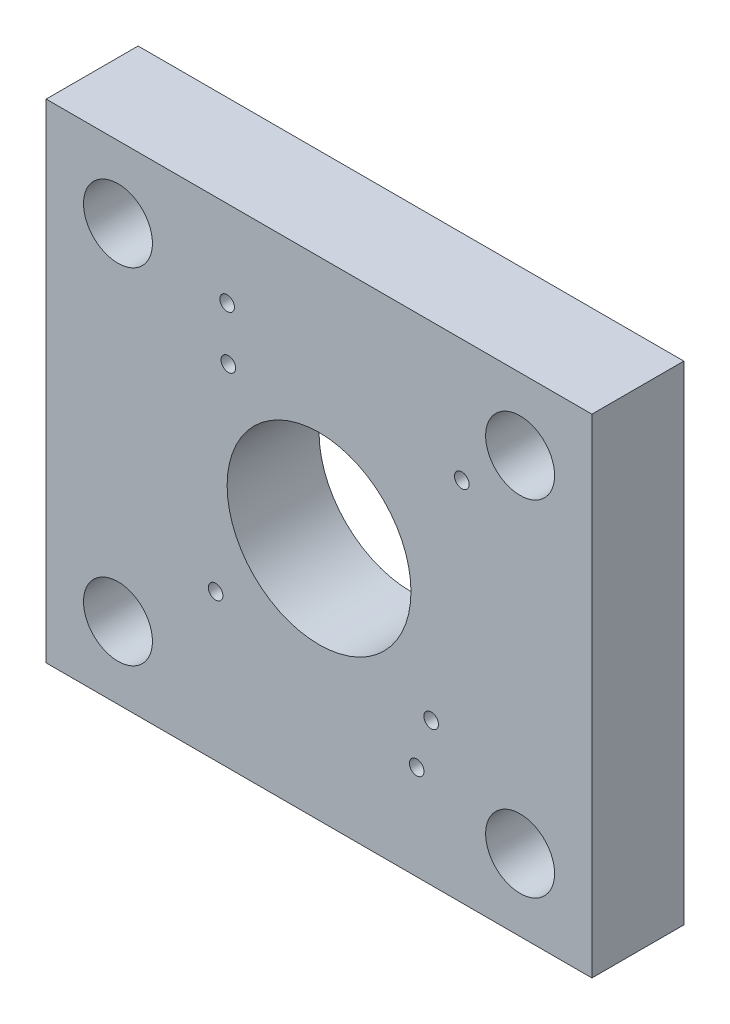
ISO-10303-21;
HEADER;
FILE_DESCRIPTION(('STEP AP214'),'2;1');
FILE_NAME('part.step','',(''),(''),'','','');
FILE_SCHEMA(('AUTOMOTIVE_DESIGN { 1 0 10303 214 1 1 1 1 }'));
ENDSEC;
DATA;
#1=APPLICATION_CONTEXT('core data for automotive mechanical design processes');
#2=APPLICATION_PROTOCOL_DEFINITION('international standard','automotive_design',2000,#1);
#3=PRODUCT_CONTEXT('',#1,'mechanical');
#4=PRODUCT('Part','Part','',(#3));
#5=PRODUCT_RELATED_PRODUCT_CATEGORY('part','',(#4));
#6=PRODUCT_DEFINITION_FORMATION('','',#4);
#7=PRODUCT_DEFINITION_CONTEXT('part definition',#1,'design');
#8=PRODUCT_DEFINITION('design','',#6,#7);
#9=PRODUCT_DEFINITION_SHAPE('','',#8);
#10=(LENGTH_UNIT() NAMED_UNIT(*) SI_UNIT(.MILLI.,.METRE.));
#11=(NAMED_UNIT(*) PLANE_ANGLE_UNIT() SI_UNIT($,.RADIAN.));
#12=(NAMED_UNIT(*) SI_UNIT($,.STERADIAN.) SOLID_ANGLE_UNIT());
#13=UNCERTAINTY_MEASURE_WITH_UNIT(LENGTH_MEASURE(1.E-05),#10,'distance_accuracy_value','');
#14=(GEOMETRIC_REPRESENTATION_CONTEXT(3) GLOBAL_UNCERTAINTY_ASSIGNED_CONTEXT((#13)) GLOBAL_UNIT_ASSIGNED_CONTEXT((#10,
#11,#12)) REPRESENTATION_CONTEXT('',''));
#15=CARTESIAN_POINT('',(0.,0.,0.));
#16=DIRECTION('',(0.,0.,1.));
#17=DIRECTION('',(1.,0.,0.));
#18=AXIS2_PLACEMENT_3D('',#15,#16,#17);
#19=CARTESIAN_POINT('',(-0.25,-0.25,1.6));
#20=DIRECTION('',(1.,0.,0.));
#21=DIRECTION('',(0.,0.,-1.));
#22=AXIS2_PLACEMENT_3D('',#19,#20,#21);
#23=PLANE('',#22);
#24=DIRECTION('',(0.,-1.,0.));
#25=VECTOR('',#24,1.);
#26=CARTESIAN_POINT('',(-0.25,-0.25,0.));
#27=LINE('',#26,#25);
#28=CARTESIAN_POINT('',(-0.25,8.25,0.));
#29=VERTEX_POINT('',#28);
#30=CARTESIAN_POINT('',(-0.25,-0.25,0.));
#31=VERTEX_POINT('',#30);
#32=EDGE_CURVE('E107',#29,#31,#27,.T.);
#33=ORIENTED_EDGE('',*,*,#32,.T.);
#34=DIRECTION('',(0.,0.,-1.));
#35=VECTOR('',#34,1.);
#36=CARTESIAN_POINT('',(-0.25,-0.25,1.6));
#37=LINE('',#36,#35);
#38=CARTESIAN_POINT('',(-0.25,-0.25,1.6));
#39=VERTEX_POINT('',#38);
#40=EDGE_CURVE('E13',#39,#31,#37,.T.);
#41=ORIENTED_EDGE('',*,*,#40,.F.);
#42=DIRECTION('',(0.,-1.,0.));
#43=VECTOR('',#42,1.);
#44=CARTESIAN_POINT('',(-0.25,-0.25,1.6));
#45=LINE('',#44,#43);
#46=CARTESIAN_POINT('',(-0.25,8.25,1.6));
#47=VERTEX_POINT('',#46);
#48=EDGE_CURVE('E95',#47,#39,#45,.T.);
#49=ORIENTED_EDGE('',*,*,#48,.F.);
#50=DIRECTION('',(0.,0.,-1.));
#51=VECTOR('',#50,1.);
#52=CARTESIAN_POINT('',(-0.25,8.25,1.6));
#53=LINE('',#52,#51);
#54=EDGE_CURVE('E103',#47,#29,#53,.T.);
#55=ORIENTED_EDGE('',*,*,#54,.T.);
#56=EDGE_LOOP('',(#33,#41,#49,#55));
#57=FACE_BOUND('',#56,.T.);
#58=ADVANCED_FACE('F44',(#57),#23,.F.);
#59=CARTESIAN_POINT('',(9.25,-0.25,1.6));
#60=DIRECTION('',(0.,1.,0.));
#61=DIRECTION('',(0.,0.,1.));
#62=AXIS2_PLACEMENT_3D('',#59,#60,#61);
#63=PLANE('',#62);
#64=DIRECTION('',(1.,0.,0.));
#65=VECTOR('',#64,1.);
#66=CARTESIAN_POINT('',(9.25,-0.25,0.));
#67=LINE('',#66,#65);
#68=CARTESIAN_POINT('',(9.25,-0.25,0.));
#69=VERTEX_POINT('',#68);
#70=EDGE_CURVE('E99',#31,#69,#67,.T.);
#71=ORIENTED_EDGE('',*,*,#70,.T.);
#72=DIRECTION('',(0.,0.,-1.));
#73=VECTOR('',#72,1.);
#74=CARTESIAN_POINT('',(9.25,-0.25,1.6));
#75=LINE('',#74,#73);
#76=CARTESIAN_POINT('',(9.25,-0.25,1.6));
#77=VERTEX_POINT('',#76);
#78=EDGE_CURVE('E52',#77,#69,#75,.T.);
#79=ORIENTED_EDGE('',*,*,#78,.F.);
#80=DIRECTION('',(1.,0.,0.));
#81=VECTOR('',#80,1.);
#82=CARTESIAN_POINT('',(9.25,-0.25,1.6));
#83=LINE('',#82,#81);
#84=EDGE_CURVE('E90',#39,#77,#83,.T.);
#85=ORIENTED_EDGE('',*,*,#84,.F.);
#86=ORIENTED_EDGE('',*,*,#40,.T.);
#87=EDGE_LOOP('',(#71,#79,#85,#86));
#88=FACE_BOUND('',#87,.T.);
#89=ADVANCED_FACE('F98',(#88),#63,.F.);
#90=CARTESIAN_POINT('',(9.25,8.25,1.6));
#91=DIRECTION('',(-1.,0.,0.));
#92=DIRECTION('',(0.,0.,1.));
#93=AXIS2_PLACEMENT_3D('',#90,#91,#92);
#94=PLANE('',#93);
#95=DIRECTION('',(0.,1.,0.));
#96=VECTOR('',#95,1.);
#97=CARTESIAN_POINT('',(9.25,8.25,0.));
#98=LINE('',#97,#96);
#99=CARTESIAN_POINT('',(9.25,8.25,0.));
#100=VERTEX_POINT('',#99);
#101=EDGE_CURVE('E77',#69,#100,#98,.T.);
#102=ORIENTED_EDGE('',*,*,#101,.T.);
#103=DIRECTION('',(0.,0.,-1.));
#104=VECTOR('',#103,1.);
#105=CARTESIAN_POINT('',(9.25,8.25,1.6));
#106=LINE('',#105,#104);
#107=CARTESIAN_POINT('',(9.25,8.25,1.6));
#108=VERTEX_POINT('',#107);
#109=EDGE_CURVE('E100',#108,#100,#106,.T.);
#110=ORIENTED_EDGE('',*,*,#109,.F.);
#111=DIRECTION('',(0.,1.,0.));
#112=VECTOR('',#111,1.);
#113=CARTESIAN_POINT('',(9.25,8.25,1.6));
#114=LINE('',#113,#112);
#115=EDGE_CURVE('E93',#77,#108,#114,.T.);
#116=ORIENTED_EDGE('',*,*,#115,.F.);
#117=ORIENTED_EDGE('',*,*,#78,.T.);
#118=EDGE_LOOP('',(#102,#110,#116,#117));
#119=FACE_BOUND('',#118,.T.);
#120=ADVANCED_FACE('F101',(#119),#94,.F.);
#121=CARTESIAN_POINT('',(-0.25,8.25,1.6));
#122=DIRECTION('',(0.,-1.,0.));
#123=DIRECTION('',(0.,0.,-1.));
#124=AXIS2_PLACEMENT_3D('',#121,#122,#123);
#125=PLANE('',#124);
#126=DIRECTION('',(-1.,0.,0.));
#127=VECTOR('',#126,1.);
#128=CARTESIAN_POINT('',(-0.25,8.25,0.));
#129=LINE('',#128,#127);
#130=EDGE_CURVE('E83',#100,#29,#129,.T.);
#131=ORIENTED_EDGE('',*,*,#130,.T.);
#132=ORIENTED_EDGE('',*,*,#54,.F.);
#133=DIRECTION('',(-1.,0.,0.));
#134=VECTOR('',#133,1.);
#135=CARTESIAN_POINT('',(-0.25,8.25,1.6));
#136=LINE('',#135,#134);
#137=EDGE_CURVE('E60',#108,#47,#136,.T.);
#138=ORIENTED_EDGE('',*,*,#137,.F.);
#139=ORIENTED_EDGE('',*,*,#109,.T.);
#140=EDGE_LOOP('',(#131,#132,#138,#139));
#141=FACE_BOUND('',#140,.T.);
#142=ADVANCED_FACE('F115',(#141),#125,.F.);
#143=CARTESIAN_POINT('',(0.,0.,1.6));
#144=DIRECTION('',(0.,0.,-1.));
#145=DIRECTION('',(-1.,0.,0.));
#146=AXIS2_PLACEMENT_3D('',#143,#144,#145);
#147=PLANE('',#146);
#148=CARTESIAN_POINT('',(2.921,5.842,1.6));
#149=DIRECTION('',(0.,0.,1.));
#150=DIRECTION('',(1.,0.,0.));
#151=AXIS2_PLACEMENT_3D('',#148,#149,#150);
#152=CIRCLE('',#151,0.127);
#153=CARTESIAN_POINT('',(3.048,5.842,1.6));
#154=VERTEX_POINT('',#153);
#155=EDGE_CURVE('E154',#154,#154,#152,.T.);
#156=ORIENTED_EDGE('',*,*,#155,.F.);
#157=EDGE_LOOP('',(#156));
#158=FACE_BOUND('',#157,.T.);
#159=CARTESIAN_POINT('',(2.9,6.7492,1.6));
#160=DIRECTION('',(0.,0.,1.));
#161=DIRECTION('',(1.,0.,0.));
#162=AXIS2_PLACEMENT_3D('',#159,#160,#161);
#163=CIRCLE('',#162,0.127);
#164=CARTESIAN_POINT('',(3.027,6.7492,1.6));
#165=VERTEX_POINT('',#164);
#166=EDGE_CURVE('E161',#165,#165,#163,.T.);
#167=ORIENTED_EDGE('',*,*,#166,.F.);
#168=EDGE_LOOP('',(#167));
#169=FACE_BOUND('',#168,.T.);
#170=CARTESIAN_POINT('',(6.2,1.4,1.6));
#171=DIRECTION('',(0.,0.,1.));
#172=DIRECTION('',(1.,0.,0.));
#173=AXIS2_PLACEMENT_3D('',#170,#171,#172);
#174=CIRCLE('',#173,0.127);
#175=CARTESIAN_POINT('',(6.327,1.4,1.6));
#176=VERTEX_POINT('',#175);
#177=EDGE_CURVE('E167',#176,#176,#174,.T.);
#178=ORIENTED_EDGE('',*,*,#177,.F.);
#179=EDGE_LOOP('',(#178));
#180=FACE_BOUND('',#179,.T.);
#181=CARTESIAN_POINT('',(2.7,2.3,1.6));
#182=DIRECTION('',(0.,0.,1.));
#183=DIRECTION('',(1.,0.,0.));
#184=AXIS2_PLACEMENT_3D('',#181,#182,#183);
#185=CIRCLE('',#184,0.127);
#186=CARTESIAN_POINT('',(2.827,2.3,1.6));
#187=VERTEX_POINT('',#186);
#188=EDGE_CURVE('E131',#187,#187,#185,.T.);
#189=ORIENTED_EDGE('',*,*,#188,.F.);
#190=EDGE_LOOP('',(#189));
#191=FACE_BOUND('',#190,.T.);
#192=CARTESIAN_POINT('',(4.5,4.,1.6));
#193=DIRECTION('',(0.,0.,1.));
#194=DIRECTION('',(1.,0.,0.));
#195=AXIS2_PLACEMENT_3D('',#192,#193,#194);
#196=CIRCLE('',#195,1.6);
#197=CARTESIAN_POINT('',(6.1,4.,1.6));
#198=VERTEX_POINT('',#197);
#199=EDGE_CURVE('E130',#198,#198,#196,.T.);
#200=ORIENTED_EDGE('',*,*,#199,.F.);
#201=EDGE_LOOP('',(#200));
#202=FACE_BOUND('',#201,.T.);
#203=CARTESIAN_POINT('',(8.,1.,1.6));
#204=DIRECTION('',(0.,0.,1.));
#205=DIRECTION('',(1.,0.,0.));
#206=AXIS2_PLACEMENT_3D('',#203,#204,#205);
#207=CIRCLE('',#206,0.6);
#208=CARTESIAN_POINT('',(8.6,1.,1.6));
#209=VERTEX_POINT('',#208);
#210=EDGE_CURVE('E137',#209,#209,#207,.T.);
#211=ORIENTED_EDGE('',*,*,#210,.F.);
#212=EDGE_LOOP('',(#211));
#213=FACE_BOUND('',#212,.T.);
#214=CARTESIAN_POINT('',(1.,1.,1.6));
#215=DIRECTION('',(0.,0.,1.));
#216=DIRECTION('',(1.,0.,0.));
#217=AXIS2_PLACEMENT_3D('',#214,#215,#216);
#218=CIRCLE('',#217,0.6);
#219=CARTESIAN_POINT('',(1.6,1.,1.6));
#220=VERTEX_POINT('',#219);
#221=EDGE_CURVE('E143',#220,#220,#218,.T.);
#222=ORIENTED_EDGE('',*,*,#221,.F.);
#223=EDGE_LOOP('',(#222));
#224=FACE_BOUND('',#223,.T.);
#225=CARTESIAN_POINT('',(1.,7.,1.6));
#226=DIRECTION('',(0.,0.,1.));
#227=DIRECTION('',(1.,0.,0.));
#228=AXIS2_PLACEMENT_3D('',#225,#226,#227);
#229=CIRCLE('',#228,0.6);
#230=CARTESIAN_POINT('',(1.6,7.,1.6));
#231=VERTEX_POINT('',#230);
#232=EDGE_CURVE('E124',#231,#231,#229,.T.);
#233=ORIENTED_EDGE('',*,*,#232,.F.);
#234=EDGE_LOOP('',(#233));
#235=FACE_BOUND('',#234,.T.);
#236=CARTESIAN_POINT('',(6.4516,2.2352,1.6));
#237=DIRECTION('',(0.,0.,1.));
#238=DIRECTION('',(1.,0.,0.));
#239=AXIS2_PLACEMENT_3D('',#236,#237,#238);
#240=CIRCLE('',#239,0.127);
#241=CARTESIAN_POINT('',(6.5786,2.2352,1.6));
#242=VERTEX_POINT('',#241);
#243=EDGE_CURVE('E155',#242,#242,#240,.T.);
#244=ORIENTED_EDGE('',*,*,#243,.F.);
#245=EDGE_LOOP('',(#244));
#246=FACE_BOUND('',#245,.T.);
#247=CARTESIAN_POINT('',(6.985,6.1214,1.6));
#248=DIRECTION('',(0.,0.,1.));
#249=DIRECTION('',(1.,0.,0.));
#250=AXIS2_PLACEMENT_3D('',#247,#248,#249);
#251=CIRCLE('',#250,0.127);
#252=CARTESIAN_POINT('',(7.112,6.1214,1.6));
#253=VERTEX_POINT('',#252);
#254=EDGE_CURVE('E178',#253,#253,#251,.T.);
#255=ORIENTED_EDGE('',*,*,#254,.F.);
#256=EDGE_LOOP('',(#255));
#257=FACE_BOUND('',#256,.T.);
#258=CARTESIAN_POINT('',(8.,7.,1.6));
#259=DIRECTION('',(0.,0.,1.));
#260=DIRECTION('',(1.,0.,0.));
#261=AXIS2_PLACEMENT_3D('',#258,#259,#260);
#262=CIRCLE('',#261,0.6);
#263=CARTESIAN_POINT('',(8.6,7.,1.6));
#264=VERTEX_POINT('',#263);
#265=EDGE_CURVE('E110',#264,#264,#262,.T.);
#266=ORIENTED_EDGE('',*,*,#265,.F.);
#267=EDGE_LOOP('',(#266));
#268=FACE_BOUND('',#267,.T.);
#269=ORIENTED_EDGE('',*,*,#48,.T.);
#270=ORIENTED_EDGE('',*,*,#84,.T.);
#271=ORIENTED_EDGE('',*,*,#115,.T.);
#272=ORIENTED_EDGE('',*,*,#137,.T.);
#273=EDGE_LOOP('',(#269,#270,#271,#272));
#274=FACE_BOUND('',#273,.T.);
#275=ADVANCED_FACE('F91',(#158,#169,#180,#191,#202,#213,#224,#235,#246,#257,#268,#274),#147,.F.);
#276=CARTESIAN_POINT('',(0.,0.,0.));
#277=DIRECTION('',(0.,0.,-1.));
#278=DIRECTION('',(-1.,0.,0.));
#279=AXIS2_PLACEMENT_3D('',#276,#277,#278);
#280=PLANE('',#279);
#281=CARTESIAN_POINT('',(2.921,5.842,0.));
#282=DIRECTION('',(0.,0.,1.));
#283=DIRECTION('',(1.,0.,0.));
#284=AXIS2_PLACEMENT_3D('',#281,#282,#283);
#285=CIRCLE('',#284,0.127);
#286=CARTESIAN_POINT('',(3.048,5.842,0.));
#287=VERTEX_POINT('',#286);
#288=EDGE_CURVE('E151',#287,#287,#285,.T.);
#289=ORIENTED_EDGE('',*,*,#288,.T.);
#290=EDGE_LOOP('',(#289));
#291=FACE_BOUND('',#290,.T.);
#292=CARTESIAN_POINT('',(2.9,6.7492,0.));
#293=DIRECTION('',(0.,0.,1.));
#294=DIRECTION('',(1.,0.,0.));
#295=AXIS2_PLACEMENT_3D('',#292,#293,#294);
#296=CIRCLE('',#295,0.127);
#297=CARTESIAN_POINT('',(3.027,6.7492,0.));
#298=VERTEX_POINT('',#297);
#299=EDGE_CURVE('E158',#298,#298,#296,.T.);
#300=ORIENTED_EDGE('',*,*,#299,.T.);
#301=EDGE_LOOP('',(#300));
#302=FACE_BOUND('',#301,.T.);
#303=CARTESIAN_POINT('',(6.2,1.4,0.));
#304=DIRECTION('',(0.,0.,1.));
#305=DIRECTION('',(1.,0.,0.));
#306=AXIS2_PLACEMENT_3D('',#303,#304,#305);
#307=CIRCLE('',#306,0.127);
#308=CARTESIAN_POINT('',(6.327,1.4,0.));
#309=VERTEX_POINT('',#308);
#310=EDGE_CURVE('E164',#309,#309,#307,.T.);
#311=ORIENTED_EDGE('',*,*,#310,.T.);
#312=EDGE_LOOP('',(#311));
#313=FACE_BOUND('',#312,.T.);
#314=CARTESIAN_POINT('',(2.7,2.3,0.));
#315=DIRECTION('',(0.,0.,1.));
#316=DIRECTION('',(1.,0.,0.));
#317=AXIS2_PLACEMENT_3D('',#314,#315,#316);
#318=CIRCLE('',#317,0.127);
#319=CARTESIAN_POINT('',(2.827,2.3,0.));
#320=VERTEX_POINT('',#319);
#321=EDGE_CURVE('E170',#320,#320,#318,.T.);
#322=ORIENTED_EDGE('',*,*,#321,.T.);
#323=EDGE_LOOP('',(#322));
#324=FACE_BOUND('',#323,.T.);
#325=CARTESIAN_POINT('',(4.5,4.,0.));
#326=DIRECTION('',(0.,0.,1.));
#327=DIRECTION('',(1.,0.,0.));
#328=AXIS2_PLACEMENT_3D('',#325,#326,#327);
#329=CIRCLE('',#328,1.6);
#330=CARTESIAN_POINT('',(6.1,4.,0.));
#331=VERTEX_POINT('',#330);
#332=EDGE_CURVE('E127',#331,#331,#329,.T.);
#333=ORIENTED_EDGE('',*,*,#332,.T.);
#334=EDGE_LOOP('',(#333));
#335=FACE_BOUND('',#334,.T.);
#336=CARTESIAN_POINT('',(8.,1.,0.));
#337=DIRECTION('',(0.,0.,1.));
#338=DIRECTION('',(1.,0.,0.));
#339=AXIS2_PLACEMENT_3D('',#336,#337,#338);
#340=CIRCLE('',#339,0.6);
#341=CARTESIAN_POINT('',(8.6,1.,0.));
#342=VERTEX_POINT('',#341);
#343=EDGE_CURVE('E134',#342,#342,#340,.T.);
#344=ORIENTED_EDGE('',*,*,#343,.T.);
#345=EDGE_LOOP('',(#344));
#346=FACE_BOUND('',#345,.T.);
#347=CARTESIAN_POINT('',(1.,1.,0.));
#348=DIRECTION('',(0.,0.,1.));
#349=DIRECTION('',(1.,0.,0.));
#350=AXIS2_PLACEMENT_3D('',#347,#348,#349);
#351=CIRCLE('',#350,0.6);
#352=CARTESIAN_POINT('',(1.6,1.,0.));
#353=VERTEX_POINT('',#352);
#354=EDGE_CURVE('E140',#353,#353,#351,.T.);
#355=ORIENTED_EDGE('',*,*,#354,.T.);
#356=EDGE_LOOP('',(#355));
#357=FACE_BOUND('',#356,.T.);
#358=CARTESIAN_POINT('',(1.,7.,0.));
#359=DIRECTION('',(0.,0.,1.));
#360=DIRECTION('',(1.,0.,0.));
#361=AXIS2_PLACEMENT_3D('',#358,#359,#360);
#362=CIRCLE('',#361,0.6);
#363=CARTESIAN_POINT('',(1.6,7.,0.));
#364=VERTEX_POINT('',#363);
#365=EDGE_CURVE('E146',#364,#364,#362,.T.);
#366=ORIENTED_EDGE('',*,*,#365,.T.);
#367=EDGE_LOOP('',(#366));
#368=FACE_BOUND('',#367,.T.);
#369=CARTESIAN_POINT('',(6.4516,2.2352,0.));
#370=DIRECTION('',(0.,0.,1.));
#371=DIRECTION('',(1.,0.,0.));
#372=AXIS2_PLACEMENT_3D('',#369,#370,#371);
#373=CIRCLE('',#372,0.127);
#374=CARTESIAN_POINT('',(6.5786,2.2352,0.));
#375=VERTEX_POINT('',#374);
#376=EDGE_CURVE('E181',#375,#375,#373,.T.);
#377=ORIENTED_EDGE('',*,*,#376,.T.);
#378=EDGE_LOOP('',(#377));
#379=FACE_BOUND('',#378,.T.);
#380=CARTESIAN_POINT('',(6.985,6.1214,0.));
#381=DIRECTION('',(0.,0.,1.));
#382=DIRECTION('',(1.,0.,0.));
#383=AXIS2_PLACEMENT_3D('',#380,#381,#382);
#384=CIRCLE('',#383,0.127);
#385=CARTESIAN_POINT('',(7.112,6.1214,0.));
#386=VERTEX_POINT('',#385);
#387=EDGE_CURVE('E175',#386,#386,#384,.T.);
#388=ORIENTED_EDGE('',*,*,#387,.T.);
#389=EDGE_LOOP('',(#388));
#390=FACE_BOUND('',#389,.T.);
#391=CARTESIAN_POINT('',(8.,7.,0.));
#392=DIRECTION('',(0.,0.,1.));
#393=DIRECTION('',(1.,0.,0.));
#394=AXIS2_PLACEMENT_3D('',#391,#392,#393);
#395=CIRCLE('',#394,0.6);
#396=CARTESIAN_POINT('',(8.6,7.,0.));
#397=VERTEX_POINT('',#396);
#398=EDGE_CURVE('E121',#397,#397,#395,.T.);
#399=ORIENTED_EDGE('',*,*,#398,.T.);
#400=EDGE_LOOP('',(#399));
#401=FACE_BOUND('',#400,.T.);
#402=ORIENTED_EDGE('',*,*,#32,.F.);
#403=ORIENTED_EDGE('',*,*,#130,.F.);
#404=ORIENTED_EDGE('',*,*,#101,.F.);
#405=ORIENTED_EDGE('',*,*,#70,.F.);
#406=EDGE_LOOP('',(#402,#403,#404,#405));
#407=FACE_BOUND('',#406,.T.);
#408=ADVANCED_FACE('F118',(#291,#302,#313,#324,#335,#346,#357,#368,#379,#390,#401,#407),#280,.T.);
#409=CARTESIAN_POINT('',(8.,7.,1.6));
#410=DIRECTION('',(0.,0.,-1.));
#411=DIRECTION('',(-1.,0.,0.));
#412=AXIS2_PLACEMENT_3D('',#409,#410,#411);
#413=CYLINDRICAL_SURFACE('',#412,0.6);
#414=ORIENTED_EDGE('',*,*,#265,.T.);
#415=EDGE_LOOP('',(#414));
#416=FACE_BOUND('',#415,.T.);
#417=ORIENTED_EDGE('',*,*,#398,.F.);
#418=EDGE_LOOP('',(#417));
#419=FACE_BOUND('',#418,.T.);
#420=ADVANCED_FACE('F198',(#416,#419),#413,.F.);
#421=CARTESIAN_POINT('',(6.985,6.1214,1.6));
#422=DIRECTION('',(0.,0.,-1.));
#423=DIRECTION('',(-1.,0.,0.));
#424=AXIS2_PLACEMENT_3D('',#421,#422,#423);
#425=CYLINDRICAL_SURFACE('',#424,0.127);
#426=ORIENTED_EDGE('',*,*,#254,.T.);
#427=EDGE_LOOP('',(#426));
#428=FACE_BOUND('',#427,.T.);
#429=ORIENTED_EDGE('',*,*,#387,.F.);
#430=EDGE_LOOP('',(#429));
#431=FACE_BOUND('',#430,.T.);
#432=ADVANCED_FACE('F201',(#428,#431),#425,.F.);
#433=CARTESIAN_POINT('',(6.4516,2.2352,1.6));
#434=DIRECTION('',(0.,0.,-1.));
#435=DIRECTION('',(-1.,0.,0.));
#436=AXIS2_PLACEMENT_3D('',#433,#434,#435);
#437=CYLINDRICAL_SURFACE('',#436,0.127);
#438=ORIENTED_EDGE('',*,*,#243,.T.);
#439=EDGE_LOOP('',(#438));
#440=FACE_BOUND('',#439,.T.);
#441=ORIENTED_EDGE('',*,*,#376,.F.);
#442=EDGE_LOOP('',(#441));
#443=FACE_BOUND('',#442,.T.);
#444=ADVANCED_FACE('F187',(#440,#443),#437,.F.);
#445=CARTESIAN_POINT('',(1.,7.,1.6));
#446=DIRECTION('',(0.,0.,-1.));
#447=DIRECTION('',(-1.,0.,0.));
#448=AXIS2_PLACEMENT_3D('',#445,#446,#447);
#449=CYLINDRICAL_SURFACE('',#448,0.6);
#450=ORIENTED_EDGE('',*,*,#232,.T.);
#451=EDGE_LOOP('',(#450));
#452=FACE_BOUND('',#451,.T.);
#453=ORIENTED_EDGE('',*,*,#365,.F.);
#454=EDGE_LOOP('',(#453));
#455=FACE_BOUND('',#454,.T.);
#456=ADVANCED_FACE('F257',(#452,#455),#449,.F.);
#457=CARTESIAN_POINT('',(1.,1.,1.6));
#458=DIRECTION('',(0.,0.,-1.));
#459=DIRECTION('',(-1.,0.,0.));
#460=AXIS2_PLACEMENT_3D('',#457,#458,#459);
#461=CYLINDRICAL_SURFACE('',#460,0.6);
#462=ORIENTED_EDGE('',*,*,#221,.T.);
#463=EDGE_LOOP('',(#462));
#464=FACE_BOUND('',#463,.T.);
#465=ORIENTED_EDGE('',*,*,#354,.F.);
#466=EDGE_LOOP('',(#465));
#467=FACE_BOUND('',#466,.T.);
#468=ADVANCED_FACE('F266',(#464,#467),#461,.F.);
#469=CARTESIAN_POINT('',(8.,1.,1.6));
#470=DIRECTION('',(0.,0.,-1.));
#471=DIRECTION('',(-1.,0.,0.));
#472=AXIS2_PLACEMENT_3D('',#469,#470,#471);
#473=CYLINDRICAL_SURFACE('',#472,0.6);
#474=ORIENTED_EDGE('',*,*,#210,.T.);
#475=EDGE_LOOP('',(#474));
#476=FACE_BOUND('',#475,.T.);
#477=ORIENTED_EDGE('',*,*,#343,.F.);
#478=EDGE_LOOP('',(#477));
#479=FACE_BOUND('',#478,.T.);
#480=ADVANCED_FACE('F276',(#476,#479),#473,.F.);
#481=CARTESIAN_POINT('',(4.5,4.,1.6));
#482=DIRECTION('',(0.,0.,-1.));
#483=DIRECTION('',(-1.,0.,0.));
#484=AXIS2_PLACEMENT_3D('',#481,#482,#483);
#485=CYLINDRICAL_SURFACE('',#484,1.6);
#486=ORIENTED_EDGE('',*,*,#199,.T.);
#487=EDGE_LOOP('',(#486));
#488=FACE_BOUND('',#487,.T.);
#489=ORIENTED_EDGE('',*,*,#332,.F.);
#490=EDGE_LOOP('',(#489));
#491=FACE_BOUND('',#490,.T.);
#492=ADVANCED_FACE('F286',(#488,#491),#485,.F.);
#493=CARTESIAN_POINT('',(2.7,2.3,1.6));
#494=DIRECTION('',(0.,0.,-1.));
#495=DIRECTION('',(-1.,0.,0.));
#496=AXIS2_PLACEMENT_3D('',#493,#494,#495);
#497=CYLINDRICAL_SURFACE('',#496,0.127);
#498=ORIENTED_EDGE('',*,*,#188,.T.);
#499=EDGE_LOOP('',(#498));
#500=FACE_BOUND('',#499,.T.);
#501=ORIENTED_EDGE('',*,*,#321,.F.);
#502=EDGE_LOOP('',(#501));
#503=FACE_BOUND('',#502,.T.);
#504=ADVANCED_FACE('F296',(#500,#503),#497,.F.);
#505=CARTESIAN_POINT('',(6.2,1.4,1.6));
#506=DIRECTION('',(0.,0.,-1.));
#507=DIRECTION('',(-1.,0.,0.));
#508=AXIS2_PLACEMENT_3D('',#505,#506,#507);
#509=CYLINDRICAL_SURFACE('',#508,0.127);
#510=ORIENTED_EDGE('',*,*,#177,.T.);
#511=EDGE_LOOP('',(#510));
#512=FACE_BOUND('',#511,.T.);
#513=ORIENTED_EDGE('',*,*,#310,.F.);
#514=EDGE_LOOP('',(#513));
#515=FACE_BOUND('',#514,.T.);
#516=ADVANCED_FACE('F306',(#512,#515),#509,.F.);
#517=CARTESIAN_POINT('',(2.9,6.7492,1.6));
#518=DIRECTION('',(0.,0.,-1.));
#519=DIRECTION('',(-1.,0.,0.));
#520=AXIS2_PLACEMENT_3D('',#517,#518,#519);
#521=CYLINDRICAL_SURFACE('',#520,0.127);
#522=ORIENTED_EDGE('',*,*,#166,.T.);
#523=EDGE_LOOP('',(#522));
#524=FACE_BOUND('',#523,.T.);
#525=ORIENTED_EDGE('',*,*,#299,.F.);
#526=EDGE_LOOP('',(#525));
#527=FACE_BOUND('',#526,.T.);
#528=ADVANCED_FACE('F316',(#524,#527),#521,.F.);
#529=CARTESIAN_POINT('',(2.921,5.842,1.6));
#530=DIRECTION('',(0.,0.,-1.));
#531=DIRECTION('',(-1.,0.,0.));
#532=AXIS2_PLACEMENT_3D('',#529,#530,#531);
#533=CYLINDRICAL_SURFACE('',#532,0.127);
#534=ORIENTED_EDGE('',*,*,#155,.T.);
#535=EDGE_LOOP('',(#534));
#536=FACE_BOUND('',#535,.T.);
#537=ORIENTED_EDGE('',*,*,#288,.F.);
#538=EDGE_LOOP('',(#537));
#539=FACE_BOUND('',#538,.T.);
#540=ADVANCED_FACE('F326',(#536,#539),#533,.F.);
#541=CLOSED_SHELL('',(#58,#89,#120,#142,#275,#408,#420,#432,#444,#456,#468,#480,#492,#504,#516,
#528,#540));
#542=MANIFOLD_SOLID_BREP('B2',#541);
#543=ADVANCED_BREP_SHAPE_REPRESENTATION('',(#18,#542),#14);
#544=SHAPE_DEFINITION_REPRESENTATION(#9,#543);
ENDSEC;
END-ISO-10303-21;
